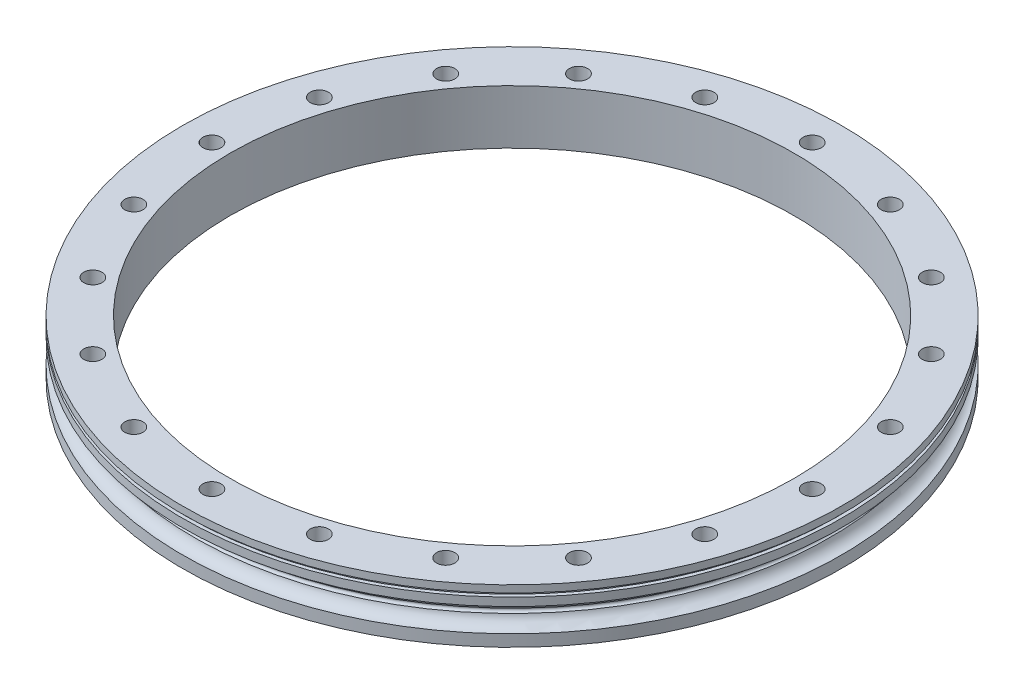
ISO-10303-21;
HEADER;
FILE_DESCRIPTION(('STEP AP214'),'2;1');
FILE_NAME('part.step','',(''),(''),'','','');
FILE_SCHEMA(('AUTOMOTIVE_DESIGN { 1 0 10303 214 1 1 1 1 }'));
ENDSEC;
DATA;
#1=APPLICATION_CONTEXT('core data for automotive mechanical design processes');
#2=APPLICATION_PROTOCOL_DEFINITION('international standard','automotive_design',2000,#1);
#3=PRODUCT_CONTEXT('',#1,'mechanical');
#4=PRODUCT('Part','Part','',(#3));
#5=PRODUCT_RELATED_PRODUCT_CATEGORY('part','',(#4));
#6=PRODUCT_DEFINITION_FORMATION('','',#4);
#7=PRODUCT_DEFINITION_CONTEXT('part definition',#1,'design');
#8=PRODUCT_DEFINITION('design','',#6,#7);
#9=PRODUCT_DEFINITION_SHAPE('','',#8);
#10=(LENGTH_UNIT() NAMED_UNIT(*) SI_UNIT(.MILLI.,.METRE.));
#11=(NAMED_UNIT(*) PLANE_ANGLE_UNIT() SI_UNIT($,.RADIAN.));
#12=(NAMED_UNIT(*) SI_UNIT($,.STERADIAN.) SOLID_ANGLE_UNIT());
#13=UNCERTAINTY_MEASURE_WITH_UNIT(LENGTH_MEASURE(1.E-05),#10,'distance_accuracy_value','');
#14=(GEOMETRIC_REPRESENTATION_CONTEXT(3) GLOBAL_UNCERTAINTY_ASSIGNED_CONTEXT((#13)) GLOBAL_UNIT_ASSIGNED_CONTEXT((#10,
#11,#12)) REPRESENTATION_CONTEXT('',''));
#15=CARTESIAN_POINT('',(0.,0.,0.));
#16=DIRECTION('',(0.,0.,1.));
#17=DIRECTION('',(1.,0.,0.));
#18=AXIS2_PLACEMENT_3D('',#15,#16,#17);
#19=CARTESIAN_POINT('',(0.,46.,0.));
#20=DIRECTION('',(0.,1.,0.));
#21=DIRECTION('',(-1.,0.,0.));
#22=AXIS2_PLACEMENT_3D('',#19,#20,#21);
#23=CYLINDRICAL_SURFACE('',#22,280.);
#24=CARTESIAN_POINT('',(0.,30.,0.));
#25=DIRECTION('',(0.,1.,0.));
#26=DIRECTION('',(-1.,0.,0.));
#27=AXIS2_PLACEMENT_3D('',#24,#25,#26);
#28=CIRCLE('',#27,280.);
#29=CARTESIAN_POINT('',(-280.,30.,0.));
#30=VERTEX_POINT('',#29);
#31=EDGE_CURVE('E71',#30,#30,#28,.T.);
#32=ORIENTED_EDGE('',*,*,#31,.T.);
#33=EDGE_LOOP('',(#32));
#34=FACE_BOUND('',#33,.T.);
#35=CARTESIAN_POINT('',(0.,37.,0.));
#36=DIRECTION('',(0.,1.,0.));
#37=DIRECTION('',(-1.,0.,0.));
#38=AXIS2_PLACEMENT_3D('',#35,#36,#37);
#39=CIRCLE('',#38,280.);
#40=CARTESIAN_POINT('',(-280.,37.,0.));
#41=VERTEX_POINT('',#40);
#42=EDGE_CURVE('E10',#41,#41,#39,.T.);
#43=ORIENTED_EDGE('',*,*,#42,.F.);
#44=EDGE_LOOP('',(#43));
#45=FACE_BOUND('',#44,.T.);
#46=ADVANCED_FACE('F31',(#34,#45),#23,.T.);
#47=CARTESIAN_POINT('',(-277.,37.,0.));
#48=DIRECTION('',(0.,1.,0.));
#49=DIRECTION('',(-1.,0.,0.));
#50=AXIS2_PLACEMENT_3D('',#47,#48,#49);
#51=PLANE('',#50);
#52=ORIENTED_EDGE('',*,*,#42,.T.);
#53=EDGE_LOOP('',(#52));
#54=FACE_BOUND('',#53,.T.);
#55=CARTESIAN_POINT('',(0.,37.,0.));
#56=DIRECTION('',(0.,1.,0.));
#57=DIRECTION('',(-1.,0.,0.));
#58=AXIS2_PLACEMENT_3D('',#55,#56,#57);
#59=CIRCLE('',#58,277.);
#60=CARTESIAN_POINT('',(-277.,37.,0.));
#61=VERTEX_POINT('',#60);
#62=EDGE_CURVE('E37',#61,#61,#59,.T.);
#63=ORIENTED_EDGE('',*,*,#62,.F.);
#64=EDGE_LOOP('',(#63));
#65=FACE_BOUND('',#64,.T.);
#66=ADVANCED_FACE('F290',(#54,#65),#51,.T.);
#67=CARTESIAN_POINT('',(0.,46.,0.));
#68=DIRECTION('',(0.,1.,0.));
#69=DIRECTION('',(-1.,0.,0.));
#70=AXIS2_PLACEMENT_3D('',#67,#68,#69);
#71=CYLINDRICAL_SURFACE('',#70,277.);
#72=ORIENTED_EDGE('',*,*,#62,.T.);
#73=EDGE_LOOP('',(#72));
#74=FACE_BOUND('',#73,.T.);
#75=CARTESIAN_POINT('',(0.,40.,0.));
#76=DIRECTION('',(0.,1.,0.));
#77=DIRECTION('',(-1.,0.,0.));
#78=AXIS2_PLACEMENT_3D('',#75,#76,#77);
#79=CIRCLE('',#78,277.);
#80=CARTESIAN_POINT('',(-277.,40.,0.));
#81=VERTEX_POINT('',#80);
#82=EDGE_CURVE('E41',#81,#81,#79,.T.);
#83=ORIENTED_EDGE('',*,*,#82,.F.);
#84=EDGE_LOOP('',(#83));
#85=FACE_BOUND('',#84,.T.);
#86=ADVANCED_FACE('F294',(#74,#85),#71,.T.);
#87=CARTESIAN_POINT('',(-280.,40.,0.));
#88=DIRECTION('',(0.,-1.,0.));
#89=DIRECTION('',(1.,0.,0.));
#90=AXIS2_PLACEMENT_3D('',#87,#88,#89);
#91=PLANE('',#90);
#92=ORIENTED_EDGE('',*,*,#82,.T.);
#93=EDGE_LOOP('',(#92));
#94=FACE_BOUND('',#93,.T.);
#95=CARTESIAN_POINT('',(0.,40.,0.));
#96=DIRECTION('',(0.,1.,0.));
#97=DIRECTION('',(-1.,0.,0.));
#98=AXIS2_PLACEMENT_3D('',#95,#96,#97);
#99=CIRCLE('',#98,280.);
#100=CARTESIAN_POINT('',(-280.,40.,0.));
#101=VERTEX_POINT('',#100);
#102=EDGE_CURVE('E45',#101,#101,#99,.T.);
#103=ORIENTED_EDGE('',*,*,#102,.F.);
#104=EDGE_LOOP('',(#103));
#105=FACE_BOUND('',#104,.T.);
#106=ADVANCED_FACE('F298',(#94,#105),#91,.T.);
#107=CARTESIAN_POINT('',(0.,46.,0.));
#108=DIRECTION('',(0.,1.,0.));
#109=DIRECTION('',(-1.,0.,0.));
#110=AXIS2_PLACEMENT_3D('',#107,#108,#109);
#111=CYLINDRICAL_SURFACE('',#110,280.);
#112=ORIENTED_EDGE('',*,*,#102,.T.);
#113=EDGE_LOOP('',(#112));
#114=FACE_BOUND('',#113,.T.);
#115=CARTESIAN_POINT('',(0.,46.,0.));
#116=DIRECTION('',(0.,1.,0.));
#117=DIRECTION('',(-1.,0.,0.));
#118=AXIS2_PLACEMENT_3D('',#115,#116,#117);
#119=CIRCLE('',#118,280.);
#120=CARTESIAN_POINT('',(-280.,46.,0.));
#121=VERTEX_POINT('',#120);
#122=EDGE_CURVE('E50',#121,#121,#119,.T.);
#123=ORIENTED_EDGE('',*,*,#122,.F.);
#124=EDGE_LOOP('',(#123));
#125=FACE_BOUND('',#124,.T.);
#126=ADVANCED_FACE('F209',(#114,#125),#111,.T.);
#127=CARTESIAN_POINT('',(-280.,46.,0.));
#128=DIRECTION('',(0.,1.,0.));
#129=DIRECTION('',(-1.,0.,0.));
#130=AXIS2_PLACEMENT_3D('',#127,#128,#129);
#131=PLANE('',#130);
#132=CARTESIAN_POINT('',(-242.519411655265,46.,78.7993335656084));
#133=DIRECTION('',(0.,1.,0.));
#134=DIRECTION('',(0.309016994374935,0.,0.951056516295158));
#135=AXIS2_PLACEMENT_3D('',#132,#133,#134);
#136=CIRCLE('',#135,7.75);
#137=CARTESIAN_POINT('',(-240.124529948859,46.,86.1700215668959));
#138=VERTEX_POINT('',#137);
#139=EDGE_CURVE('E188',#138,#138,#136,.T.);
#140=ORIENTED_EDGE('',*,*,#139,.F.);
#141=EDGE_LOOP('',(#140));
#142=FACE_BOUND('',#141,.T.);
#143=CARTESIAN_POINT('',(-206.299333565614,46.,149.885239334578));
#144=DIRECTION('',(0.,1.,0.));
#145=DIRECTION('',(0.587785252292462,0.,0.809016994374955));
#146=AXIS2_PLACEMENT_3D('',#143,#144,#145);
#147=CIRCLE('',#146,7.75);
#148=CARTESIAN_POINT('',(-201.743997860347,46.,156.155121040984));
#149=VERTEX_POINT('',#148);
#150=EDGE_CURVE('E182',#149,#149,#147,.T.);
#151=ORIENTED_EDGE('',*,*,#150,.F.);
#152=EDGE_LOOP('',(#151));
#153=FACE_BOUND('',#152,.T.);
#154=CARTESIAN_POINT('',(-149.885239334583,46.,206.29933356561));
#155=DIRECTION('',(0.,1.,0.));
#156=DIRECTION('',(0.80901699437494,0.,0.587785252292483));
#157=AXIS2_PLACEMENT_3D('',#154,#155,#156);
#158=CIRCLE('',#157,7.75);
#159=CARTESIAN_POINT('',(-143.615357628177,46.,210.854669270877));
#160=VERTEX_POINT('',#159);
#161=EDGE_CURVE('E176',#160,#160,#158,.T.);
#162=ORIENTED_EDGE('',*,*,#161,.F.);
#163=EDGE_LOOP('',(#162));
#164=FACE_BOUND('',#163,.T.);
#165=CARTESIAN_POINT('',(-78.7993335656143,46.,242.519411655263));
#166=DIRECTION('',(0.,1.,0.));
#167=DIRECTION('',(0.95105651629515,0.,0.309016994374958));
#168=AXIS2_PLACEMENT_3D('',#165,#166,#167);
#169=CIRCLE('',#168,7.75);
#170=CARTESIAN_POINT('',(-71.4286455643269,46.,244.914293361669));
#171=VERTEX_POINT('',#170);
#172=EDGE_CURVE('E170',#171,#171,#169,.T.);
#173=ORIENTED_EDGE('',*,*,#172,.F.);
#174=EDGE_LOOP('',(#173));
#175=FACE_BOUND('',#174,.T.);
#176=CARTESIAN_POINT('',(-2.63975473083674E-12,46.,255.));
#177=DIRECTION('',(0.,1.,0.));
#178=DIRECTION('',(1.,0.,0.));
#179=AXIS2_PLACEMENT_3D('',#176,#177,#178);
#180=CIRCLE('',#179,7.75);
#181=CARTESIAN_POINT('',(7.74999999999736,46.,255.));
#182=VERTEX_POINT('',#181);
#183=EDGE_CURVE('E164',#182,#182,#180,.T.);
#184=ORIENTED_EDGE('',*,*,#183,.F.);
#185=EDGE_LOOP('',(#184));
#186=FACE_BOUND('',#185,.T.);
#187=CARTESIAN_POINT('',(78.7993335656093,46.,242.519411655265));
#188=DIRECTION('',(0.,1.,0.));
#189=DIRECTION('',(0.951056516295157,0.,-0.309016994374938));
#190=AXIS2_PLACEMENT_3D('',#187,#188,#189);
#191=CIRCLE('',#190,7.75);
#192=CARTESIAN_POINT('',(86.1700215668968,46.,240.124529948859));
#193=VERTEX_POINT('',#192);
#194=EDGE_CURVE('E158',#193,#193,#191,.T.);
#195=ORIENTED_EDGE('',*,*,#194,.F.);
#196=EDGE_LOOP('',(#195));
#197=FACE_BOUND('',#196,.T.);
#198=CARTESIAN_POINT('',(149.885239334579,46.,206.299333565613));
#199=DIRECTION('',(0.,1.,0.));
#200=DIRECTION('',(0.809016994374953,0.,-0.587785252292465));
#201=AXIS2_PLACEMENT_3D('',#198,#199,#200);
#202=CIRCLE('',#201,7.75);
#203=CARTESIAN_POINT('',(156.155121040985,46.,201.743997860346));
#204=VERTEX_POINT('',#203);
#205=EDGE_CURVE('E152',#204,#204,#202,.T.);
#206=ORIENTED_EDGE('',*,*,#205,.F.);
#207=EDGE_LOOP('',(#206));
#208=FACE_BOUND('',#207,.T.);
#209=CARTESIAN_POINT('',(206.29933356561,46.,149.885239334582));
#210=DIRECTION('',(0.,1.,0.));
#211=DIRECTION('',(0.58778525229248,0.,-0.809016994374942));
#212=AXIS2_PLACEMENT_3D('',#209,#210,#211);
#213=CIRCLE('',#212,7.75);
#214=CARTESIAN_POINT('',(210.854669270877,46.,143.615357628177));
#215=VERTEX_POINT('',#214);
#216=EDGE_CURVE('E146',#215,#215,#213,.T.);
#217=ORIENTED_EDGE('',*,*,#216,.F.);
#218=EDGE_LOOP('',(#217));
#219=FACE_BOUND('',#218,.T.);
#220=CARTESIAN_POINT('',(242.519411655264,46.,78.7993335656135));
#221=DIRECTION('',(0.,1.,0.));
#222=DIRECTION('',(0.309016994374955,0.,-0.951056516295151));
#223=AXIS2_PLACEMENT_3D('',#220,#221,#222);
#224=CIRCLE('',#223,7.75);
#225=CARTESIAN_POINT('',(244.914293361669,46.,71.4286455643261));
#226=VERTEX_POINT('',#225);
#227=EDGE_CURVE('E140',#226,#226,#224,.T.);
#228=ORIENTED_EDGE('',*,*,#227,.F.);
#229=EDGE_LOOP('',(#228));
#230=FACE_BOUND('',#229,.T.);
#231=CARTESIAN_POINT('',(255.,46.,0.));
#232=DIRECTION('',(0.,1.,0.));
#233=DIRECTION('',(0.,0.,-1.));
#234=AXIS2_PLACEMENT_3D('',#231,#232,#233);
#235=CIRCLE('',#234,7.75);
#236=CARTESIAN_POINT('',(255.,46.,-7.75000000000003));
#237=VERTEX_POINT('',#236);
#238=EDGE_CURVE('E134',#237,#237,#235,.T.);
#239=ORIENTED_EDGE('',*,*,#238,.F.);
#240=EDGE_LOOP('',(#239));
#241=FACE_BOUND('',#240,.T.);
#242=CARTESIAN_POINT('',(242.519411655265,46.,-78.79933356561));
#243=DIRECTION('',(0.,1.,0.));
#244=DIRECTION('',(-0.309016994374941,0.,-0.951056516295156));
#245=AXIS2_PLACEMENT_3D('',#242,#243,#244);
#246=CIRCLE('',#245,7.75);
#247=CARTESIAN_POINT('',(240.124529948859,46.,-86.1700215668975));
#248=VERTEX_POINT('',#247);
#249=EDGE_CURVE('E128',#248,#248,#246,.T.);
#250=ORIENTED_EDGE('',*,*,#249,.F.);
#251=EDGE_LOOP('',(#250));
#252=FACE_BOUND('',#251,.T.);
#253=CARTESIAN_POINT('',(206.299333565612,46.,-149.885239334579));
#254=DIRECTION('',(0.,1.,0.));
#255=DIRECTION('',(-0.587785252292469,0.,-0.809016994374951));
#256=AXIS2_PLACEMENT_3D('',#253,#254,#255);
#257=CIRCLE('',#256,7.75);
#258=CARTESIAN_POINT('',(201.743997860346,46.,-156.155121040985));
#259=VERTEX_POINT('',#258);
#260=EDGE_CURVE('E122',#259,#259,#257,.T.);
#261=ORIENTED_EDGE('',*,*,#260,.F.);
#262=EDGE_LOOP('',(#261));
#263=FACE_BOUND('',#262,.T.);
#264=CARTESIAN_POINT('',(149.885239334582,46.,-206.299333565611));
#265=DIRECTION('',(0.,1.,0.));
#266=DIRECTION('',(-0.809016994374945,0.,-0.587785252292477));
#267=AXIS2_PLACEMENT_3D('',#264,#265,#266);
#268=CIRCLE('',#267,7.75);
#269=CARTESIAN_POINT('',(143.615357628176,46.,-210.854669270878));
#270=VERTEX_POINT('',#269);
#271=EDGE_CURVE('E116',#270,#270,#268,.T.);
#272=ORIENTED_EDGE('',*,*,#271,.F.);
#273=EDGE_LOOP('',(#272));
#274=FACE_BOUND('',#273,.T.);
#275=CARTESIAN_POINT('',(78.7993335656126,46.,-242.519411655264));
#276=DIRECTION('',(0.,1.,0.));
#277=DIRECTION('',(-0.951056516295152,0.,-0.309016994374952));
#278=AXIS2_PLACEMENT_3D('',#275,#276,#277);
#279=CIRCLE('',#278,7.75);
#280=CARTESIAN_POINT('',(71.4286455643252,46.,-244.91429336167));
#281=VERTEX_POINT('',#280);
#282=EDGE_CURVE('E110',#281,#281,#279,.T.);
#283=ORIENTED_EDGE('',*,*,#282,.F.);
#284=EDGE_LOOP('',(#283));
#285=FACE_BOUND('',#284,.T.);
#286=CARTESIAN_POINT('',(8.59099248026741E-13,46.,-255.));
#287=DIRECTION('',(0.,1.,0.));
#288=DIRECTION('',(-1.,0.,0.));
#289=AXIS2_PLACEMENT_3D('',#286,#287,#288);
#290=CIRCLE('',#289,7.75);
#291=CARTESIAN_POINT('',(-7.74999999999914,46.,-255.));
#292=VERTEX_POINT('',#291);
#293=EDGE_CURVE('E104',#292,#292,#290,.T.);
#294=ORIENTED_EDGE('',*,*,#293,.F.);
#295=EDGE_LOOP('',(#294));
#296=FACE_BOUND('',#295,.T.);
#297=CARTESIAN_POINT('',(-78.799333565611,46.,-242.519411655264));
#298=DIRECTION('',(0.,1.,0.));
#299=DIRECTION('',(-0.951056516295155,0.,0.309016994374945));
#300=AXIS2_PLACEMENT_3D('',#297,#298,#299);
#301=CIRCLE('',#300,7.75);
#302=CARTESIAN_POINT('',(-86.1700215668984,46.,-240.124529948859));
#303=VERTEX_POINT('',#302);
#304=EDGE_CURVE('E98',#303,#303,#301,.T.);
#305=ORIENTED_EDGE('',*,*,#304,.F.);
#306=EDGE_LOOP('',(#305));
#307=FACE_BOUND('',#306,.T.);
#308=CARTESIAN_POINT('',(-149.88523933458,46.,-206.299333565612));
#309=DIRECTION('',(0.,1.,0.));
#310=DIRECTION('',(-0.809016994374949,0.,0.587785252292471));
#311=AXIS2_PLACEMENT_3D('',#308,#309,#310);
#312=CIRCLE('',#311,7.75);
#313=CARTESIAN_POINT('',(-156.155121040986,46.,-201.743997860345));
#314=VERTEX_POINT('',#313);
#315=EDGE_CURVE('E92',#314,#314,#312,.T.);
#316=ORIENTED_EDGE('',*,*,#315,.F.);
#317=EDGE_LOOP('',(#316));
#318=FACE_BOUND('',#317,.T.);
#319=CARTESIAN_POINT('',(-206.299333565611,46.,-149.885239334581));
#320=DIRECTION('',(0.,1.,0.));
#321=DIRECTION('',(-0.587785252292474,0.,0.809016994374947));
#322=AXIS2_PLACEMENT_3D('',#319,#320,#321);
#323=CIRCLE('',#322,7.75);
#324=CARTESIAN_POINT('',(-210.854669270878,46.,-143.615357628175));
#325=VERTEX_POINT('',#324);
#326=EDGE_CURVE('E86',#325,#325,#323,.T.);
#327=ORIENTED_EDGE('',*,*,#326,.F.);
#328=EDGE_LOOP('',(#327));
#329=FACE_BOUND('',#328,.T.);
#330=CARTESIAN_POINT('',(-242.519411655264,46.,-78.7993335656117));
#331=DIRECTION('',(0.,1.,0.));
#332=DIRECTION('',(-0.309016994374948,0.,0.951056516295154));
#333=AXIS2_PLACEMENT_3D('',#330,#331,#332);
#334=CIRCLE('',#333,7.75);
#335=CARTESIAN_POINT('',(-244.91429336167,46.,-71.4286455643243));
#336=VERTEX_POINT('',#335);
#337=EDGE_CURVE('E78',#336,#336,#334,.T.);
#338=ORIENTED_EDGE('',*,*,#337,.F.);
#339=EDGE_LOOP('',(#338));
#340=FACE_BOUND('',#339,.T.);
#341=CARTESIAN_POINT('',(-255.,46.,0.));
#342=DIRECTION('',(0.,1.,0.));
#343=DIRECTION('',(0.,0.,1.));
#344=AXIS2_PLACEMENT_3D('',#341,#342,#343);
#345=CIRCLE('',#344,7.75);
#346=CARTESIAN_POINT('',(-255.,46.,7.75000000000003));
#347=VERTEX_POINT('',#346);
#348=EDGE_CURVE('E75',#347,#347,#345,.T.);
#349=ORIENTED_EDGE('',*,*,#348,.F.);
#350=EDGE_LOOP('',(#349));
#351=FACE_BOUND('',#350,.T.);
#352=ORIENTED_EDGE('',*,*,#122,.T.);
#353=EDGE_LOOP('',(#352));
#354=FACE_BOUND('',#353,.T.);
#355=CARTESIAN_POINT('',(0.,46.,0.));
#356=DIRECTION('',(0.,1.,0.));
#357=DIRECTION('',(-1.,0.,0.));
#358=AXIS2_PLACEMENT_3D('',#355,#356,#357);
#359=CIRCLE('',#358,239.5);
#360=CARTESIAN_POINT('',(-239.5,46.,0.));
#361=VERTEX_POINT('',#360);
#362=EDGE_CURVE('E53',#361,#361,#359,.T.);
#363=ORIENTED_EDGE('',*,*,#362,.F.);
#364=EDGE_LOOP('',(#363));
#365=FACE_BOUND('',#364,.T.);
#366=ADVANCED_FACE('F205',(#142,#153,#164,#175,#186,#197,#208,#219,#230,#241,#252,#263,#274,
#285,#296,#307,#318,#329,#340,#351,#354,#365),#131,.T.);
#367=CARTESIAN_POINT('',(0.,46.,0.));
#368=DIRECTION('',(0.,1.,0.));
#369=DIRECTION('',(-1.,0.,0.));
#370=AXIS2_PLACEMENT_3D('',#367,#368,#369);
#371=CYLINDRICAL_SURFACE('',#370,239.5);
#372=ORIENTED_EDGE('',*,*,#362,.T.);
#373=EDGE_LOOP('',(#372));
#374=FACE_BOUND('',#373,.T.);
#375=CARTESIAN_POINT('',(0.,0.,0.));
#376=DIRECTION('',(0.,1.,0.));
#377=DIRECTION('',(-1.,0.,0.));
#378=AXIS2_PLACEMENT_3D('',#375,#376,#377);
#379=CIRCLE('',#378,239.5);
#380=CARTESIAN_POINT('',(-239.5,0.,0.));
#381=VERTEX_POINT('',#380);
#382=EDGE_CURVE('E56',#381,#381,#379,.T.);
#383=ORIENTED_EDGE('',*,*,#382,.F.);
#384=EDGE_LOOP('',(#383));
#385=FACE_BOUND('',#384,.T.);
#386=ADVANCED_FACE('F208',(#374,#385),#371,.F.);
#387=CARTESIAN_POINT('',(-239.5,0.,0.));
#388=DIRECTION('',(0.,-1.,0.));
#389=DIRECTION('',(1.,0.,0.));
#390=AXIS2_PLACEMENT_3D('',#387,#388,#389);
#391=PLANE('',#390);
#392=CARTESIAN_POINT('',(-242.519411655265,0.,78.7993335656084));
#393=DIRECTION('',(0.,1.,0.));
#394=DIRECTION('',(0.309016994374935,0.,0.951056516295158));
#395=AXIS2_PLACEMENT_3D('',#392,#393,#394);
#396=CIRCLE('',#395,7.75);
#397=CARTESIAN_POINT('',(-240.124529948859,0.,86.1700215668959));
#398=VERTEX_POINT('',#397);
#399=EDGE_CURVE('E191',#398,#398,#396,.T.);
#400=ORIENTED_EDGE('',*,*,#399,.T.);
#401=EDGE_LOOP('',(#400));
#402=FACE_BOUND('',#401,.T.);
#403=CARTESIAN_POINT('',(-206.299333565614,0.,149.885239334578));
#404=DIRECTION('',(0.,1.,0.));
#405=DIRECTION('',(0.587785252292462,0.,0.809016994374955));
#406=AXIS2_PLACEMENT_3D('',#403,#404,#405);
#407=CIRCLE('',#406,7.75);
#408=CARTESIAN_POINT('',(-201.743997860347,0.,156.155121040984));
#409=VERTEX_POINT('',#408);
#410=EDGE_CURVE('E185',#409,#409,#407,.T.);
#411=ORIENTED_EDGE('',*,*,#410,.T.);
#412=EDGE_LOOP('',(#411));
#413=FACE_BOUND('',#412,.T.);
#414=CARTESIAN_POINT('',(-149.885239334583,0.,206.29933356561));
#415=DIRECTION('',(0.,1.,0.));
#416=DIRECTION('',(0.80901699437494,0.,0.587785252292483));
#417=AXIS2_PLACEMENT_3D('',#414,#415,#416);
#418=CIRCLE('',#417,7.75);
#419=CARTESIAN_POINT('',(-143.615357628177,0.,210.854669270877));
#420=VERTEX_POINT('',#419);
#421=EDGE_CURVE('E179',#420,#420,#418,.T.);
#422=ORIENTED_EDGE('',*,*,#421,.T.);
#423=EDGE_LOOP('',(#422));
#424=FACE_BOUND('',#423,.T.);
#425=CARTESIAN_POINT('',(-78.7993335656143,0.,242.519411655263));
#426=DIRECTION('',(0.,1.,0.));
#427=DIRECTION('',(0.95105651629515,0.,0.309016994374958));
#428=AXIS2_PLACEMENT_3D('',#425,#426,#427);
#429=CIRCLE('',#428,7.75);
#430=CARTESIAN_POINT('',(-71.4286455643269,0.,244.914293361669));
#431=VERTEX_POINT('',#430);
#432=EDGE_CURVE('E173',#431,#431,#429,.T.);
#433=ORIENTED_EDGE('',*,*,#432,.T.);
#434=EDGE_LOOP('',(#433));
#435=FACE_BOUND('',#434,.T.);
#436=CARTESIAN_POINT('',(-2.63975473083674E-12,0.,255.));
#437=DIRECTION('',(0.,1.,0.));
#438=DIRECTION('',(1.,0.,0.));
#439=AXIS2_PLACEMENT_3D('',#436,#437,#438);
#440=CIRCLE('',#439,7.75);
#441=CARTESIAN_POINT('',(7.74999999999736,0.,255.));
#442=VERTEX_POINT('',#441);
#443=EDGE_CURVE('E167',#442,#442,#440,.T.);
#444=ORIENTED_EDGE('',*,*,#443,.T.);
#445=EDGE_LOOP('',(#444));
#446=FACE_BOUND('',#445,.T.);
#447=CARTESIAN_POINT('',(78.7993335656093,0.,242.519411655265));
#448=DIRECTION('',(0.,1.,0.));
#449=DIRECTION('',(0.951056516295157,0.,-0.309016994374938));
#450=AXIS2_PLACEMENT_3D('',#447,#448,#449);
#451=CIRCLE('',#450,7.75);
#452=CARTESIAN_POINT('',(86.1700215668968,0.,240.124529948859));
#453=VERTEX_POINT('',#452);
#454=EDGE_CURVE('E161',#453,#453,#451,.T.);
#455=ORIENTED_EDGE('',*,*,#454,.T.);
#456=EDGE_LOOP('',(#455));
#457=FACE_BOUND('',#456,.T.);
#458=CARTESIAN_POINT('',(149.885239334579,0.,206.299333565613));
#459=DIRECTION('',(0.,1.,0.));
#460=DIRECTION('',(0.809016994374953,0.,-0.587785252292465));
#461=AXIS2_PLACEMENT_3D('',#458,#459,#460);
#462=CIRCLE('',#461,7.75);
#463=CARTESIAN_POINT('',(156.155121040985,0.,201.743997860346));
#464=VERTEX_POINT('',#463);
#465=EDGE_CURVE('E155',#464,#464,#462,.T.);
#466=ORIENTED_EDGE('',*,*,#465,.T.);
#467=EDGE_LOOP('',(#466));
#468=FACE_BOUND('',#467,.T.);
#469=CARTESIAN_POINT('',(206.29933356561,0.,149.885239334582));
#470=DIRECTION('',(0.,1.,0.));
#471=DIRECTION('',(0.58778525229248,0.,-0.809016994374942));
#472=AXIS2_PLACEMENT_3D('',#469,#470,#471);
#473=CIRCLE('',#472,7.75);
#474=CARTESIAN_POINT('',(210.854669270877,0.,143.615357628177));
#475=VERTEX_POINT('',#474);
#476=EDGE_CURVE('E149',#475,#475,#473,.T.);
#477=ORIENTED_EDGE('',*,*,#476,.T.);
#478=EDGE_LOOP('',(#477));
#479=FACE_BOUND('',#478,.T.);
#480=CARTESIAN_POINT('',(242.519411655264,0.,78.7993335656135));
#481=DIRECTION('',(0.,1.,0.));
#482=DIRECTION('',(0.309016994374955,0.,-0.951056516295151));
#483=AXIS2_PLACEMENT_3D('',#480,#481,#482);
#484=CIRCLE('',#483,7.75);
#485=CARTESIAN_POINT('',(244.914293361669,0.,71.4286455643261));
#486=VERTEX_POINT('',#485);
#487=EDGE_CURVE('E143',#486,#486,#484,.T.);
#488=ORIENTED_EDGE('',*,*,#487,.T.);
#489=EDGE_LOOP('',(#488));
#490=FACE_BOUND('',#489,.T.);
#491=CARTESIAN_POINT('',(255.,0.,0.));
#492=DIRECTION('',(0.,1.,0.));
#493=DIRECTION('',(0.,0.,-1.));
#494=AXIS2_PLACEMENT_3D('',#491,#492,#493);
#495=CIRCLE('',#494,7.75);
#496=CARTESIAN_POINT('',(255.,0.,-7.75000000000003));
#497=VERTEX_POINT('',#496);
#498=EDGE_CURVE('E137',#497,#497,#495,.T.);
#499=ORIENTED_EDGE('',*,*,#498,.T.);
#500=EDGE_LOOP('',(#499));
#501=FACE_BOUND('',#500,.T.);
#502=CARTESIAN_POINT('',(242.519411655265,0.,-78.79933356561));
#503=DIRECTION('',(0.,1.,0.));
#504=DIRECTION('',(-0.309016994374941,0.,-0.951056516295156));
#505=AXIS2_PLACEMENT_3D('',#502,#503,#504);
#506=CIRCLE('',#505,7.75);
#507=CARTESIAN_POINT('',(240.124529948859,0.,-86.1700215668975));
#508=VERTEX_POINT('',#507);
#509=EDGE_CURVE('E131',#508,#508,#506,.T.);
#510=ORIENTED_EDGE('',*,*,#509,.T.);
#511=EDGE_LOOP('',(#510));
#512=FACE_BOUND('',#511,.T.);
#513=CARTESIAN_POINT('',(206.299333565612,0.,-149.885239334579));
#514=DIRECTION('',(0.,1.,0.));
#515=DIRECTION('',(-0.587785252292469,0.,-0.809016994374951));
#516=AXIS2_PLACEMENT_3D('',#513,#514,#515);
#517=CIRCLE('',#516,7.75);
#518=CARTESIAN_POINT('',(201.743997860346,0.,-156.155121040985));
#519=VERTEX_POINT('',#518);
#520=EDGE_CURVE('E125',#519,#519,#517,.T.);
#521=ORIENTED_EDGE('',*,*,#520,.T.);
#522=EDGE_LOOP('',(#521));
#523=FACE_BOUND('',#522,.T.);
#524=CARTESIAN_POINT('',(149.885239334582,0.,-206.299333565611));
#525=DIRECTION('',(0.,1.,0.));
#526=DIRECTION('',(-0.809016994374945,0.,-0.587785252292477));
#527=AXIS2_PLACEMENT_3D('',#524,#525,#526);
#528=CIRCLE('',#527,7.75);
#529=CARTESIAN_POINT('',(143.615357628176,0.,-210.854669270878));
#530=VERTEX_POINT('',#529);
#531=EDGE_CURVE('E119',#530,#530,#528,.T.);
#532=ORIENTED_EDGE('',*,*,#531,.T.);
#533=EDGE_LOOP('',(#532));
#534=FACE_BOUND('',#533,.T.);
#535=CARTESIAN_POINT('',(78.7993335656126,0.,-242.519411655264));
#536=DIRECTION('',(0.,1.,0.));
#537=DIRECTION('',(-0.951056516295152,0.,-0.309016994374952));
#538=AXIS2_PLACEMENT_3D('',#535,#536,#537);
#539=CIRCLE('',#538,7.75);
#540=CARTESIAN_POINT('',(71.4286455643252,0.,-244.91429336167));
#541=VERTEX_POINT('',#540);
#542=EDGE_CURVE('E113',#541,#541,#539,.T.);
#543=ORIENTED_EDGE('',*,*,#542,.T.);
#544=EDGE_LOOP('',(#543));
#545=FACE_BOUND('',#544,.T.);
#546=CARTESIAN_POINT('',(8.59099248026741E-13,0.,-255.));
#547=DIRECTION('',(0.,1.,0.));
#548=DIRECTION('',(-1.,0.,0.));
#549=AXIS2_PLACEMENT_3D('',#546,#547,#548);
#550=CIRCLE('',#549,7.75);
#551=CARTESIAN_POINT('',(-7.74999999999914,0.,-255.));
#552=VERTEX_POINT('',#551);
#553=EDGE_CURVE('E107',#552,#552,#550,.T.);
#554=ORIENTED_EDGE('',*,*,#553,.T.);
#555=EDGE_LOOP('',(#554));
#556=FACE_BOUND('',#555,.T.);
#557=CARTESIAN_POINT('',(-78.799333565611,0.,-242.519411655264));
#558=DIRECTION('',(0.,1.,0.));
#559=DIRECTION('',(-0.951056516295155,0.,0.309016994374945));
#560=AXIS2_PLACEMENT_3D('',#557,#558,#559);
#561=CIRCLE('',#560,7.75);
#562=CARTESIAN_POINT('',(-86.1700215668984,0.,-240.124529948859));
#563=VERTEX_POINT('',#562);
#564=EDGE_CURVE('E101',#563,#563,#561,.T.);
#565=ORIENTED_EDGE('',*,*,#564,.T.);
#566=EDGE_LOOP('',(#565));
#567=FACE_BOUND('',#566,.T.);
#568=CARTESIAN_POINT('',(-149.88523933458,0.,-206.299333565612));
#569=DIRECTION('',(0.,1.,0.));
#570=DIRECTION('',(-0.809016994374949,0.,0.587785252292471));
#571=AXIS2_PLACEMENT_3D('',#568,#569,#570);
#572=CIRCLE('',#571,7.75);
#573=CARTESIAN_POINT('',(-156.155121040986,0.,-201.743997860345));
#574=VERTEX_POINT('',#573);
#575=EDGE_CURVE('E95',#574,#574,#572,.T.);
#576=ORIENTED_EDGE('',*,*,#575,.T.);
#577=EDGE_LOOP('',(#576));
#578=FACE_BOUND('',#577,.T.);
#579=CARTESIAN_POINT('',(-206.299333565611,0.,-149.885239334581));
#580=DIRECTION('',(0.,1.,0.));
#581=DIRECTION('',(-0.587785252292474,0.,0.809016994374947));
#582=AXIS2_PLACEMENT_3D('',#579,#580,#581);
#583=CIRCLE('',#582,7.75);
#584=CARTESIAN_POINT('',(-210.854669270878,0.,-143.615357628175));
#585=VERTEX_POINT('',#584);
#586=EDGE_CURVE('E89',#585,#585,#583,.T.);
#587=ORIENTED_EDGE('',*,*,#586,.T.);
#588=EDGE_LOOP('',(#587));
#589=FACE_BOUND('',#588,.T.);
#590=CARTESIAN_POINT('',(-242.519411655264,0.,-78.7993335656117));
#591=DIRECTION('',(0.,1.,0.));
#592=DIRECTION('',(-0.309016994374948,0.,0.951056516295154));
#593=AXIS2_PLACEMENT_3D('',#590,#591,#592);
#594=CIRCLE('',#593,7.75);
#595=CARTESIAN_POINT('',(-244.91429336167,0.,-71.4286455643243));
#596=VERTEX_POINT('',#595);
#597=EDGE_CURVE('E83',#596,#596,#594,.T.);
#598=ORIENTED_EDGE('',*,*,#597,.T.);
#599=EDGE_LOOP('',(#598));
#600=FACE_BOUND('',#599,.T.);
#601=CARTESIAN_POINT('',(-255.,0.,0.));
#602=DIRECTION('',(0.,1.,0.));
#603=DIRECTION('',(0.,0.,1.));
#604=AXIS2_PLACEMENT_3D('',#601,#602,#603);
#605=CIRCLE('',#604,7.75);
#606=CARTESIAN_POINT('',(-255.,0.,7.75000000000003));
#607=VERTEX_POINT('',#606);
#608=EDGE_CURVE('E74',#607,#607,#605,.T.);
#609=ORIENTED_EDGE('',*,*,#608,.T.);
#610=EDGE_LOOP('',(#609));
#611=FACE_BOUND('',#610,.T.);
#612=ORIENTED_EDGE('',*,*,#382,.T.);
#613=EDGE_LOOP('',(#612));
#614=FACE_BOUND('',#613,.T.);
#615=CARTESIAN_POINT('',(0.,0.,0.));
#616=DIRECTION('',(0.,1.,0.));
#617=DIRECTION('',(-1.,0.,0.));
#618=AXIS2_PLACEMENT_3D('',#615,#616,#617);
#619=CIRCLE('',#618,280.);
#620=CARTESIAN_POINT('',(-280.,0.,0.));
#621=VERTEX_POINT('',#620);
#622=EDGE_CURVE('E59',#621,#621,#619,.T.);
#623=ORIENTED_EDGE('',*,*,#622,.F.);
#624=EDGE_LOOP('',(#623));
#625=FACE_BOUND('',#624,.T.);
#626=ADVANCED_FACE('F195',(#402,#413,#424,#435,#446,#457,#468,#479,#490,#501,#512,#523,#534,
#545,#556,#567,#578,#589,#600,#611,#614,#625),#391,.T.);
#627=CARTESIAN_POINT('',(0.,46.,0.));
#628=DIRECTION('',(0.,1.,0.));
#629=DIRECTION('',(-1.,0.,0.));
#630=AXIS2_PLACEMENT_3D('',#627,#628,#629);
#631=CYLINDRICAL_SURFACE('',#630,280.);
#632=ORIENTED_EDGE('',*,*,#622,.T.);
#633=EDGE_LOOP('',(#632));
#634=FACE_BOUND('',#633,.T.);
#635=CARTESIAN_POINT('',(0.,9.99999999999997,0.));
#636=DIRECTION('',(0.,1.,0.));
#637=DIRECTION('',(-1.,0.,0.));
#638=AXIS2_PLACEMENT_3D('',#635,#636,#637);
#639=CIRCLE('',#638,280.);
#640=CARTESIAN_POINT('',(-280.,9.99999999999997,0.));
#641=VERTEX_POINT('',#640);
#642=EDGE_CURVE('E62',#641,#641,#639,.T.);
#643=ORIENTED_EDGE('',*,*,#642,.F.);
#644=EDGE_LOOP('',(#643));
#645=FACE_BOUND('',#644,.T.);
#646=ADVANCED_FACE('F260',(#634,#645),#631,.T.);
#647=CARTESIAN_POINT('',(0.,20.,0.));
#648=DIRECTION('',(0.,1.,0.));
#649=DIRECTION('',(-1.,0.,0.));
#650=AXIS2_PLACEMENT_3D('',#647,#648,#649);
#651=TOROIDAL_SURFACE('',#650,280.,9.99999999999999);
#652=ORIENTED_EDGE('',*,*,#642,.T.);
#653=EDGE_LOOP('',(#652));
#654=FACE_BOUND('',#653,.T.);
#655=CARTESIAN_POINT('',(0.,18.0230290524583,0.));
#656=DIRECTION('',(0.,1.,0.));
#657=DIRECTION('',(-1.,0.,0.));
#658=AXIS2_PLACEMENT_3D('',#655,#656,#657);
#659=CIRCLE('',#658,270.197368421053);
#660=CARTESIAN_POINT('',(-270.197368421053,18.0230290524583,0.));
#661=VERTEX_POINT('',#660);
#662=EDGE_CURVE('E65',#661,#661,#659,.T.);
#663=ORIENTED_EDGE('',*,*,#662,.F.);
#664=EDGE_LOOP('',(#663));
#665=FACE_BOUND('',#664,.T.);
#666=ADVANCED_FACE('F266',(#654,#665),#651,.F.);
#667=CARTESIAN_POINT('',(0.,20.,0.));
#668=DIRECTION('',(0.,1.,0.));
#669=DIRECTION('',(-1.,0.,0.));
#670=AXIS2_PLACEMENT_3D('',#667,#668,#669);
#671=TOROIDAL_SURFACE('',#670,270.5,1.99999999999999);
#672=ORIENTED_EDGE('',*,*,#662,.T.);
#673=EDGE_LOOP('',(#672));
#674=FACE_BOUND('',#673,.T.);
#675=CARTESIAN_POINT('',(0.,21.9769709475416,0.));
#676=DIRECTION('',(0.,1.,0.));
#677=DIRECTION('',(-1.,0.,0.));
#678=AXIS2_PLACEMENT_3D('',#675,#676,#677);
#679=CIRCLE('',#678,270.197368421053);
#680=CARTESIAN_POINT('',(-270.197368421053,21.9769709475416,0.));
#681=VERTEX_POINT('',#680);
#682=EDGE_CURVE('E68',#681,#681,#679,.T.);
#683=ORIENTED_EDGE('',*,*,#682,.F.);
#684=EDGE_LOOP('',(#683));
#685=FACE_BOUND('',#684,.T.);
#686=ADVANCED_FACE('F272',(#674,#685),#671,.F.);
#687=CARTESIAN_POINT('',(0.,20.,0.));
#688=DIRECTION('',(0.,1.,0.));
#689=DIRECTION('',(-1.,0.,0.));
#690=AXIS2_PLACEMENT_3D('',#687,#688,#689);
#691=TOROIDAL_SURFACE('',#690,280.,9.99999999999999);
#692=ORIENTED_EDGE('',*,*,#682,.T.);
#693=EDGE_LOOP('',(#692));
#694=FACE_BOUND('',#693,.T.);
#695=ORIENTED_EDGE('',*,*,#31,.F.);
#696=EDGE_LOOP('',(#695));
#697=FACE_BOUND('',#696,.T.);
#698=ADVANCED_FACE('F278',(#694,#697),#691,.F.);
#699=CARTESIAN_POINT('',(-255.,0.,0.));
#700=DIRECTION('',(0.,1.,0.));
#701=DIRECTION('',(0.,0.,1.));
#702=AXIS2_PLACEMENT_3D('',#699,#700,#701);
#703=CYLINDRICAL_SURFACE('',#702,7.75);
#704=ORIENTED_EDGE('',*,*,#608,.F.);
#705=EDGE_LOOP('',(#704));
#706=FACE_BOUND('',#705,.T.);
#707=ORIENTED_EDGE('',*,*,#348,.T.);
#708=EDGE_LOOP('',(#707));
#709=FACE_BOUND('',#708,.T.);
#710=ADVANCED_FACE('F284',(#706,#709),#703,.F.);
#711=CARTESIAN_POINT('',(-242.519411655264,0.,-78.7993335656117));
#712=DIRECTION('',(0.,1.,0.));
#713=DIRECTION('',(-0.309016994374948,0.,0.951056516295154));
#714=AXIS2_PLACEMENT_3D('',#711,#712,#713);
#715=CYLINDRICAL_SURFACE('',#714,7.75);
#716=ORIENTED_EDGE('',*,*,#597,.F.);
#717=EDGE_LOOP('',(#716));
#718=FACE_BOUND('',#717,.T.);
#719=ORIENTED_EDGE('',*,*,#337,.T.);
#720=EDGE_LOOP('',(#719));
#721=FACE_BOUND('',#720,.T.);
#722=ADVANCED_FACE('F310',(#718,#721),#715,.F.);
#723=CARTESIAN_POINT('',(-206.299333565611,0.,-149.885239334581));
#724=DIRECTION('',(0.,1.,0.));
#725=DIRECTION('',(-0.587785252292474,0.,0.809016994374947));
#726=AXIS2_PLACEMENT_3D('',#723,#724,#725);
#727=CYLINDRICAL_SURFACE('',#726,7.75);
#728=ORIENTED_EDGE('',*,*,#586,.F.);
#729=EDGE_LOOP('',(#728));
#730=FACE_BOUND('',#729,.T.);
#731=ORIENTED_EDGE('',*,*,#326,.T.);
#732=EDGE_LOOP('',(#731));
#733=FACE_BOUND('',#732,.T.);
#734=ADVANCED_FACE('F314',(#730,#733),#727,.F.);
#735=CARTESIAN_POINT('',(-149.88523933458,0.,-206.299333565612));
#736=DIRECTION('',(0.,1.,0.));
#737=DIRECTION('',(-0.809016994374949,0.,0.587785252292471));
#738=AXIS2_PLACEMENT_3D('',#735,#736,#737);
#739=CYLINDRICAL_SURFACE('',#738,7.75);
#740=ORIENTED_EDGE('',*,*,#575,.F.);
#741=EDGE_LOOP('',(#740));
#742=FACE_BOUND('',#741,.T.);
#743=ORIENTED_EDGE('',*,*,#315,.T.);
#744=EDGE_LOOP('',(#743));
#745=FACE_BOUND('',#744,.T.);
#746=ADVANCED_FACE('F318',(#742,#745),#739,.F.);
#747=CARTESIAN_POINT('',(-78.799333565611,0.,-242.519411655264));
#748=DIRECTION('',(0.,1.,0.));
#749=DIRECTION('',(-0.951056516295155,0.,0.309016994374945));
#750=AXIS2_PLACEMENT_3D('',#747,#748,#749);
#751=CYLINDRICAL_SURFACE('',#750,7.75);
#752=ORIENTED_EDGE('',*,*,#564,.F.);
#753=EDGE_LOOP('',(#752));
#754=FACE_BOUND('',#753,.T.);
#755=ORIENTED_EDGE('',*,*,#304,.T.);
#756=EDGE_LOOP('',(#755));
#757=FACE_BOUND('',#756,.T.);
#758=ADVANCED_FACE('F322',(#754,#757),#751,.F.);
#759=CARTESIAN_POINT('',(8.59099248026741E-13,0.,-255.));
#760=DIRECTION('',(0.,1.,0.));
#761=DIRECTION('',(-1.,0.,0.));
#762=AXIS2_PLACEMENT_3D('',#759,#760,#761);
#763=CYLINDRICAL_SURFACE('',#762,7.75);
#764=ORIENTED_EDGE('',*,*,#553,.F.);
#765=EDGE_LOOP('',(#764));
#766=FACE_BOUND('',#765,.T.);
#767=ORIENTED_EDGE('',*,*,#293,.T.);
#768=EDGE_LOOP('',(#767));
#769=FACE_BOUND('',#768,.T.);
#770=ADVANCED_FACE('F326',(#766,#769),#763,.F.);
#771=CARTESIAN_POINT('',(78.7993335656126,0.,-242.519411655264));
#772=DIRECTION('',(0.,1.,0.));
#773=DIRECTION('',(-0.951056516295152,0.,-0.309016994374952));
#774=AXIS2_PLACEMENT_3D('',#771,#772,#773);
#775=CYLINDRICAL_SURFACE('',#774,7.75);
#776=ORIENTED_EDGE('',*,*,#542,.F.);
#777=EDGE_LOOP('',(#776));
#778=FACE_BOUND('',#777,.T.);
#779=ORIENTED_EDGE('',*,*,#282,.T.);
#780=EDGE_LOOP('',(#779));
#781=FACE_BOUND('',#780,.T.);
#782=ADVANCED_FACE('F330',(#778,#781),#775,.F.);
#783=CARTESIAN_POINT('',(149.885239334582,0.,-206.299333565611));
#784=DIRECTION('',(0.,1.,0.));
#785=DIRECTION('',(-0.809016994374945,0.,-0.587785252292477));
#786=AXIS2_PLACEMENT_3D('',#783,#784,#785);
#787=CYLINDRICAL_SURFACE('',#786,7.75);
#788=ORIENTED_EDGE('',*,*,#531,.F.);
#789=EDGE_LOOP('',(#788));
#790=FACE_BOUND('',#789,.T.);
#791=ORIENTED_EDGE('',*,*,#271,.T.);
#792=EDGE_LOOP('',(#791));
#793=FACE_BOUND('',#792,.T.);
#794=ADVANCED_FACE('F334',(#790,#793),#787,.F.);
#795=CARTESIAN_POINT('',(206.299333565612,0.,-149.885239334579));
#796=DIRECTION('',(0.,1.,0.));
#797=DIRECTION('',(-0.587785252292469,0.,-0.809016994374951));
#798=AXIS2_PLACEMENT_3D('',#795,#796,#797);
#799=CYLINDRICAL_SURFACE('',#798,7.75);
#800=ORIENTED_EDGE('',*,*,#520,.F.);
#801=EDGE_LOOP('',(#800));
#802=FACE_BOUND('',#801,.T.);
#803=ORIENTED_EDGE('',*,*,#260,.T.);
#804=EDGE_LOOP('',(#803));
#805=FACE_BOUND('',#804,.T.);
#806=ADVANCED_FACE('F338',(#802,#805),#799,.F.);
#807=CARTESIAN_POINT('',(242.519411655265,0.,-78.79933356561));
#808=DIRECTION('',(0.,1.,0.));
#809=DIRECTION('',(-0.309016994374941,0.,-0.951056516295156));
#810=AXIS2_PLACEMENT_3D('',#807,#808,#809);
#811=CYLINDRICAL_SURFACE('',#810,7.75);
#812=ORIENTED_EDGE('',*,*,#509,.F.);
#813=EDGE_LOOP('',(#812));
#814=FACE_BOUND('',#813,.T.);
#815=ORIENTED_EDGE('',*,*,#249,.T.);
#816=EDGE_LOOP('',(#815));
#817=FACE_BOUND('',#816,.T.);
#818=ADVANCED_FACE('F342',(#814,#817),#811,.F.);
#819=CARTESIAN_POINT('',(255.,0.,0.));
#820=DIRECTION('',(0.,1.,0.));
#821=DIRECTION('',(0.,0.,-1.));
#822=AXIS2_PLACEMENT_3D('',#819,#820,#821);
#823=CYLINDRICAL_SURFACE('',#822,7.75);
#824=ORIENTED_EDGE('',*,*,#498,.F.);
#825=EDGE_LOOP('',(#824));
#826=FACE_BOUND('',#825,.T.);
#827=ORIENTED_EDGE('',*,*,#238,.T.);
#828=EDGE_LOOP('',(#827));
#829=FACE_BOUND('',#828,.T.);
#830=ADVANCED_FACE('F346',(#826,#829),#823,.F.);
#831=CARTESIAN_POINT('',(242.519411655264,0.,78.7993335656135));
#832=DIRECTION('',(0.,1.,0.));
#833=DIRECTION('',(0.309016994374955,0.,-0.951056516295151));
#834=AXIS2_PLACEMENT_3D('',#831,#832,#833);
#835=CYLINDRICAL_SURFACE('',#834,7.75);
#836=ORIENTED_EDGE('',*,*,#487,.F.);
#837=EDGE_LOOP('',(#836));
#838=FACE_BOUND('',#837,.T.);
#839=ORIENTED_EDGE('',*,*,#227,.T.);
#840=EDGE_LOOP('',(#839));
#841=FACE_BOUND('',#840,.T.);
#842=ADVANCED_FACE('F350',(#838,#841),#835,.F.);
#843=CARTESIAN_POINT('',(206.29933356561,0.,149.885239334582));
#844=DIRECTION('',(0.,1.,0.));
#845=DIRECTION('',(0.58778525229248,0.,-0.809016994374942));
#846=AXIS2_PLACEMENT_3D('',#843,#844,#845);
#847=CYLINDRICAL_SURFACE('',#846,7.75);
#848=ORIENTED_EDGE('',*,*,#476,.F.);
#849=EDGE_LOOP('',(#848));
#850=FACE_BOUND('',#849,.T.);
#851=ORIENTED_EDGE('',*,*,#216,.T.);
#852=EDGE_LOOP('',(#851));
#853=FACE_BOUND('',#852,.T.);
#854=ADVANCED_FACE('F354',(#850,#853),#847,.F.);
#855=CARTESIAN_POINT('',(149.885239334579,0.,206.299333565613));
#856=DIRECTION('',(0.,1.,0.));
#857=DIRECTION('',(0.809016994374953,0.,-0.587785252292465));
#858=AXIS2_PLACEMENT_3D('',#855,#856,#857);
#859=CYLINDRICAL_SURFACE('',#858,7.75);
#860=ORIENTED_EDGE('',*,*,#465,.F.);
#861=EDGE_LOOP('',(#860));
#862=FACE_BOUND('',#861,.T.);
#863=ORIENTED_EDGE('',*,*,#205,.T.);
#864=EDGE_LOOP('',(#863));
#865=FACE_BOUND('',#864,.T.);
#866=ADVANCED_FACE('F358',(#862,#865),#859,.F.);
#867=CARTESIAN_POINT('',(78.7993335656093,0.,242.519411655265));
#868=DIRECTION('',(0.,1.,0.));
#869=DIRECTION('',(0.951056516295157,0.,-0.309016994374938));
#870=AXIS2_PLACEMENT_3D('',#867,#868,#869);
#871=CYLINDRICAL_SURFACE('',#870,7.75);
#872=ORIENTED_EDGE('',*,*,#454,.F.);
#873=EDGE_LOOP('',(#872));
#874=FACE_BOUND('',#873,.T.);
#875=ORIENTED_EDGE('',*,*,#194,.T.);
#876=EDGE_LOOP('',(#875));
#877=FACE_BOUND('',#876,.T.);
#878=ADVANCED_FACE('F362',(#874,#877),#871,.F.);
#879=CARTESIAN_POINT('',(-2.63975473083674E-12,0.,255.));
#880=DIRECTION('',(0.,1.,0.));
#881=DIRECTION('',(1.,0.,0.));
#882=AXIS2_PLACEMENT_3D('',#879,#880,#881);
#883=CYLINDRICAL_SURFACE('',#882,7.75);
#884=ORIENTED_EDGE('',*,*,#443,.F.);
#885=EDGE_LOOP('',(#884));
#886=FACE_BOUND('',#885,.T.);
#887=ORIENTED_EDGE('',*,*,#183,.T.);
#888=EDGE_LOOP('',(#887));
#889=FACE_BOUND('',#888,.T.);
#890=ADVANCED_FACE('F366',(#886,#889),#883,.F.);
#891=CARTESIAN_POINT('',(-78.7993335656143,0.,242.519411655263));
#892=DIRECTION('',(0.,1.,0.));
#893=DIRECTION('',(0.95105651629515,0.,0.309016994374958));
#894=AXIS2_PLACEMENT_3D('',#891,#892,#893);
#895=CYLINDRICAL_SURFACE('',#894,7.75);
#896=ORIENTED_EDGE('',*,*,#432,.F.);
#897=EDGE_LOOP('',(#896));
#898=FACE_BOUND('',#897,.T.);
#899=ORIENTED_EDGE('',*,*,#172,.T.);
#900=EDGE_LOOP('',(#899));
#901=FACE_BOUND('',#900,.T.);
#902=ADVANCED_FACE('F370',(#898,#901),#895,.F.);
#903=CARTESIAN_POINT('',(-149.885239334583,0.,206.29933356561));
#904=DIRECTION('',(0.,1.,0.));
#905=DIRECTION('',(0.80901699437494,0.,0.587785252292483));
#906=AXIS2_PLACEMENT_3D('',#903,#904,#905);
#907=CYLINDRICAL_SURFACE('',#906,7.75);
#908=ORIENTED_EDGE('',*,*,#421,.F.);
#909=EDGE_LOOP('',(#908));
#910=FACE_BOUND('',#909,.T.);
#911=ORIENTED_EDGE('',*,*,#161,.T.);
#912=EDGE_LOOP('',(#911));
#913=FACE_BOUND('',#912,.T.);
#914=ADVANCED_FACE('F374',(#910,#913),#907,.F.);
#915=CARTESIAN_POINT('',(-206.299333565614,0.,149.885239334578));
#916=DIRECTION('',(0.,1.,0.));
#917=DIRECTION('',(0.587785252292462,0.,0.809016994374955));
#918=AXIS2_PLACEMENT_3D('',#915,#916,#917);
#919=CYLINDRICAL_SURFACE('',#918,7.75);
#920=ORIENTED_EDGE('',*,*,#410,.F.);
#921=EDGE_LOOP('',(#920));
#922=FACE_BOUND('',#921,.T.);
#923=ORIENTED_EDGE('',*,*,#150,.T.);
#924=EDGE_LOOP('',(#923));
#925=FACE_BOUND('',#924,.T.);
#926=ADVANCED_FACE('F201',(#922,#925),#919,.F.);
#927=CARTESIAN_POINT('',(-242.519411655265,0.,78.7993335656084));
#928=DIRECTION('',(0.,1.,0.));
#929=DIRECTION('',(0.309016994374935,0.,0.951056516295158));
#930=AXIS2_PLACEMENT_3D('',#927,#928,#929);
#931=CYLINDRICAL_SURFACE('',#930,7.75);
#932=ORIENTED_EDGE('',*,*,#399,.F.);
#933=EDGE_LOOP('',(#932));
#934=FACE_BOUND('',#933,.T.);
#935=ORIENTED_EDGE('',*,*,#139,.T.);
#936=EDGE_LOOP('',(#935));
#937=FACE_BOUND('',#936,.T.);
#938=ADVANCED_FACE('F198',(#934,#937),#931,.F.);
#939=CLOSED_SHELL('',(#46,#66,#86,#106,#126,#366,#386,#626,#646,#666,#686,#698,#710,#722,#734,
#746,#758,#770,#782,#794,#806,#818,#830,#842,#854,#866,#878,#890,#902,#914,#926,#938));
#940=MANIFOLD_SOLID_BREP('B2',#939);
#941=ADVANCED_BREP_SHAPE_REPRESENTATION('',(#18,#940),#14);
#942=SHAPE_DEFINITION_REPRESENTATION(#9,#941);
ENDSEC;
END-ISO-10303-21;
